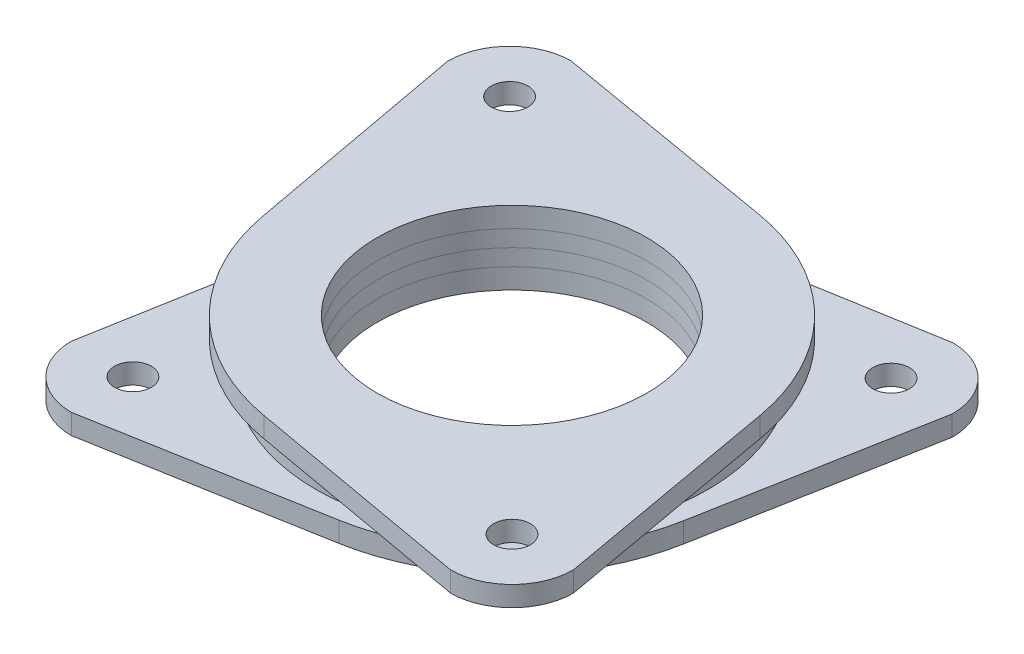
ISO-10303-21;
HEADER;
FILE_DESCRIPTION(('STEP AP214'),'2;1');
FILE_NAME('part.step','',(''),(''),'','','');
FILE_SCHEMA(('AUTOMOTIVE_DESIGN { 1 0 10303 214 1 1 1 1 }'));
ENDSEC;
DATA;
#1=APPLICATION_CONTEXT('core data for automotive mechanical design processes');
#2=APPLICATION_PROTOCOL_DEFINITION('international standard','automotive_design',2000,#1);
#3=PRODUCT_CONTEXT('',#1,'mechanical');
#4=PRODUCT('Part','Part','',(#3));
#5=PRODUCT_RELATED_PRODUCT_CATEGORY('part','',(#4));
#6=PRODUCT_DEFINITION_FORMATION('','',#4);
#7=PRODUCT_DEFINITION_CONTEXT('part definition',#1,'design');
#8=PRODUCT_DEFINITION('design','',#6,#7);
#9=PRODUCT_DEFINITION_SHAPE('','',#8);
#10=(LENGTH_UNIT() NAMED_UNIT(*) SI_UNIT(.MILLI.,.METRE.));
#11=(NAMED_UNIT(*) PLANE_ANGLE_UNIT() SI_UNIT($,.RADIAN.));
#12=(NAMED_UNIT(*) SI_UNIT($,.STERADIAN.) SOLID_ANGLE_UNIT());
#13=UNCERTAINTY_MEASURE_WITH_UNIT(LENGTH_MEASURE(1.E-05),#10,'distance_accuracy_value','');
#14=(GEOMETRIC_REPRESENTATION_CONTEXT(3) GLOBAL_UNCERTAINTY_ASSIGNED_CONTEXT((#13)) GLOBAL_UNIT_ASSIGNED_CONTEXT((#10,
#11,#12)) REPRESENTATION_CONTEXT('',''));
#15=CARTESIAN_POINT('',(0.,0.,0.));
#16=DIRECTION('',(0.,0.,1.));
#17=DIRECTION('',(1.,0.,0.));
#18=AXIS2_PLACEMENT_3D('',#15,#16,#17);
#19=CARTESIAN_POINT('',(9130.97484811199,21445.9893933236,33823.751186384));
#20=DIRECTION('',(0.,1.,0.));
#21=DIRECTION('',(0.,0.,1.));
#22=AXIS2_PLACEMENT_3D('',#19,#20,#21);
#23=PLANE('',#22);
#24=CARTESIAN_POINT('',(9130.97484811199,21445.9893933236,33823.751186384));
#25=DIRECTION('',(0.,1.,0.));
#26=DIRECTION('',(0.,0.,1.));
#27=AXIS2_PLACEMENT_3D('',#24,#25,#26);
#28=CIRCLE('',#27,16.);
#29=CARTESIAN_POINT('',(9130.97484811199,21445.9893933236,33839.751186384));
#30=VERTEX_POINT('',#29);
#31=EDGE_CURVE('P0_E12',#30,#30,#28,.T.);
#32=ORIENTED_EDGE('',*,*,#31,.T.);
#33=EDGE_LOOP('',(#32));
#34=FACE_BOUND('',#33,.T.);
#35=CARTESIAN_POINT('',(9130.97484811199,21445.9893933236,33823.751186384));
#36=DIRECTION('',(0.,1.,0.));
#37=DIRECTION('',(0.,0.,1.));
#38=AXIS2_PLACEMENT_3D('',#35,#36,#37);
#39=CIRCLE('',#38,11.025);
#40=CARTESIAN_POINT('',(9130.97484811199,21445.9893933236,33834.776186384));
#41=VERTEX_POINT('',#40);
#42=EDGE_CURVE('P0_E33',#41,#41,#39,.T.);
#43=ORIENTED_EDGE('',*,*,#42,.F.);
#44=EDGE_LOOP('',(#43));
#45=FACE_BOUND('',#44,.T.);
#46=ADVANCED_FACE('P0_F22',(#34,#45),#23,.T.);
#47=CARTESIAN_POINT('',(9130.97484811199,21444.6393933236,33823.751186384));
#48=DIRECTION('',(0.,1.,0.));
#49=DIRECTION('',(0.,0.,1.));
#50=AXIS2_PLACEMENT_3D('',#47,#48,#49);
#51=PLANE('',#50);
#52=CARTESIAN_POINT('',(9130.97484811199,21444.6393933236,33823.751186384));
#53=DIRECTION('',(0.,1.,0.));
#54=DIRECTION('',(0.,0.,1.));
#55=AXIS2_PLACEMENT_3D('',#52,#53,#54);
#56=CIRCLE('',#55,16.);
#57=CARTESIAN_POINT('',(9130.97484811199,21444.6393933236,33839.751186384));
#58=VERTEX_POINT('',#57);
#59=EDGE_CURVE('P0_E26',#58,#58,#56,.T.);
#60=ORIENTED_EDGE('',*,*,#59,.F.);
#61=EDGE_LOOP('',(#60));
#62=FACE_BOUND('',#61,.T.);
#63=CARTESIAN_POINT('',(9130.97484811199,21444.6393933236,33823.751186384));
#64=DIRECTION('',(0.,1.,0.));
#65=DIRECTION('',(0.,0.,1.));
#66=AXIS2_PLACEMENT_3D('',#63,#64,#65);
#67=CIRCLE('',#66,11.025);
#68=CARTESIAN_POINT('',(9130.97484811199,21444.6393933236,33834.776186384));
#69=VERTEX_POINT('',#68);
#70=EDGE_CURVE('P0_E35',#69,#69,#67,.T.);
#71=ORIENTED_EDGE('',*,*,#70,.T.);
#72=EDGE_LOOP('',(#71));
#73=FACE_BOUND('',#72,.T.);
#74=ADVANCED_FACE('P0_F45',(#62,#73),#51,.F.);
#75=CARTESIAN_POINT('',(9130.97484811199,21445.9893933236,33823.751186384));
#76=DIRECTION('',(0.,-1.,0.));
#77=DIRECTION('',(0.,0.,-1.));
#78=AXIS2_PLACEMENT_3D('',#75,#76,#77);
#79=CYLINDRICAL_SURFACE('',#78,16.);
#80=ORIENTED_EDGE('',*,*,#31,.F.);
#81=EDGE_LOOP('',(#80));
#82=FACE_BOUND('',#81,.T.);
#83=ORIENTED_EDGE('',*,*,#59,.T.);
#84=EDGE_LOOP('',(#83));
#85=FACE_BOUND('',#84,.T.);
#86=ADVANCED_FACE('P0_F24',(#82,#85),#79,.T.);
#87=CARTESIAN_POINT('',(9130.97484811199,21445.9893933236,33823.751186384));
#88=DIRECTION('',(0.,-1.,0.));
#89=DIRECTION('',(0.,0.,-1.));
#90=AXIS2_PLACEMENT_3D('',#87,#88,#89);
#91=CYLINDRICAL_SURFACE('',#90,11.025);
#92=ORIENTED_EDGE('',*,*,#42,.T.);
#93=EDGE_LOOP('',(#92));
#94=FACE_BOUND('',#93,.T.);
#95=ORIENTED_EDGE('',*,*,#70,.F.);
#96=EDGE_LOOP('',(#95));
#97=FACE_BOUND('',#96,.T.);
#98=ADVANCED_FACE('P0_F41',(#94,#97),#91,.F.);
#99=CLOSED_SHELL('',(#46,#74,#86,#98));
#100=MANIFOLD_SOLID_BREP('P0_B1',#99);
#101=CARTESIAN_POINT('',(9146.57249053942,21444.6393933236,33808.3494478229));
#102=DIRECTION('',(0.,-1.,0.));
#103=DIRECTION('',(0.,0.,-1.));
#104=AXIS2_PLACEMENT_3D('',#101,#102,#103);
#105=CYLINDRICAL_SURFACE('',#104,5.03499820531251);
#106=CARTESIAN_POINT('',(9146.57249053942,21442.9893933236,33808.3494478229));
#107=DIRECTION('',(0.,1.,0.));
#108=DIRECTION('',(0.,0.,1.));
#109=AXIS2_PLACEMENT_3D('',#106,#107,#108);
#110=CIRCLE('',#109,5.03499820531251);
#111=CARTESIAN_POINT('',(9146.60430910764,21442.9893933236,33803.3145501569));
#112=VERTEX_POINT('',#111);
#113=CARTESIAN_POINT('',(9151.60738820533,21442.9893933236,33808.3812663911));
#114=VERTEX_POINT('',#113);
#115=EDGE_CURVE('P1_E139',#112,#114,#110,.F.);
#116=ORIENTED_EDGE('',*,*,#115,.F.);
#117=DIRECTION('',(0.,-1.,0.));
#118=VECTOR('',#117,1.);
#119=CARTESIAN_POINT('',(9146.60430910764,21444.6393933236,33803.3145501569));
#120=LINE('',#119,#118);
#121=CARTESIAN_POINT('',(9146.60430910764,21444.6393933236,33803.3145501569));
#122=VERTEX_POINT('',#121);
#123=EDGE_CURVE('P1_E13',#122,#112,#120,.T.);
#124=ORIENTED_EDGE('',*,*,#123,.F.);
#125=CARTESIAN_POINT('',(9146.57249053942,21444.6393933236,33808.3494478229));
#126=DIRECTION('',(0.,1.,0.));
#127=DIRECTION('',(0.,0.,1.));
#128=AXIS2_PLACEMENT_3D('',#125,#126,#127);
#129=CIRCLE('',#128,5.03499820531251);
#130=CARTESIAN_POINT('',(9151.60738820533,21444.6393933236,33808.3812663911));
#131=VERTEX_POINT('',#130);
#132=EDGE_CURVE('P1_E220',#122,#131,#129,.F.);
#133=ORIENTED_EDGE('',*,*,#132,.T.);
#134=DIRECTION('',(0.,-1.,0.));
#135=VECTOR('',#134,1.);
#136=CARTESIAN_POINT('',(9151.60738820533,21444.6393933236,33808.3812663911));
#137=LINE('',#136,#135);
#138=EDGE_CURVE('P1_E41',#131,#114,#137,.T.);
#139=ORIENTED_EDGE('',*,*,#138,.T.);
#140=EDGE_LOOP('',(#116,#124,#133,#139));
#141=FACE_BOUND('',#140,.T.);
#142=ADVANCED_FACE('P1_F24',(#141),#105,.T.);
#143=CARTESIAN_POINT('',(9128.01616117805,21444.6393933236,33806.5031090524));
#144=DIRECTION('',(0.169067824794288,0.,0.985604418932528));
#145=DIRECTION('',(0.985604418932528,0.,-0.169067824794288));
#146=AXIS2_PLACEMENT_3D('',#143,#144,#145);
#147=PLANE('',#146);
#148=DIRECTION('',(-0.985604418932528,0.,0.169067824794288));
#149=VECTOR('',#148,1.);
#150=CARTESIAN_POINT('',(9128.01616117805,21442.9893933236,33806.5031090524));
#151=LINE('',#150,#149);
#152=CARTESIAN_POINT('',(9128.01616117805,21442.9893933236,33806.5031090524));
#153=VERTEX_POINT('',#152);
#154=EDGE_CURVE('P1_E136',#112,#153,#151,.T.);
#155=ORIENTED_EDGE('',*,*,#154,.T.);
#156=DIRECTION('',(0.,-1.,0.));
#157=VECTOR('',#156,1.);
#158=CARTESIAN_POINT('',(9128.01616117805,21444.6393933236,33806.5031090524));
#159=LINE('',#158,#157);
#160=CARTESIAN_POINT('',(9128.01616117805,21444.6393933236,33806.5031090524));
#161=VERTEX_POINT('',#160);
#162=EDGE_CURVE('P1_E33',#161,#153,#159,.T.);
#163=ORIENTED_EDGE('',*,*,#162,.F.);
#164=DIRECTION('',(-0.985604418932528,0.,0.169067824794288));
#165=VECTOR('',#164,1.);
#166=CARTESIAN_POINT('',(9128.01616117805,21444.6393933236,33806.5031090524));
#167=LINE('',#166,#165);
#168=EDGE_CURVE('P1_E222',#122,#161,#167,.T.);
#169=ORIENTED_EDGE('',*,*,#168,.F.);
#170=ORIENTED_EDGE('',*,*,#123,.T.);
#171=EDGE_LOOP('',(#155,#163,#169,#170));
#172=FACE_BOUND('',#171,.T.);
#173=ADVANCED_FACE('P1_F137',(#172),#147,.F.);
#174=CARTESIAN_POINT('',(9130.97484811199,21444.6393933236,33823.751186384));
#175=DIRECTION('',(0.,-1.,0.));
#176=DIRECTION('',(0.,0.,-1.));
#177=AXIS2_PLACEMENT_3D('',#174,#175,#176);
#178=CYLINDRICAL_SURFACE('',#177,17.5000000002764);
#179=CARTESIAN_POINT('',(9130.97484811199,21442.9893933236,33823.751186384));
#180=DIRECTION('',(0.,1.,0.));
#181=DIRECTION('',(0.,0.,1.));
#182=AXIS2_PLACEMENT_3D('',#179,#180,#181);
#183=CIRCLE('',#182,17.5000000002764);
#184=CARTESIAN_POINT('',(9113.74581255351,21442.9893933236,33820.6835596574));
#185=VERTEX_POINT('',#184);
#186=EDGE_CURVE('P1_E130',#153,#185,#183,.T.);
#187=ORIENTED_EDGE('',*,*,#186,.T.);
#188=DIRECTION('',(0.,-1.,0.));
#189=VECTOR('',#188,1.);
#190=CARTESIAN_POINT('',(9113.74581255351,21444.6393933236,33820.6835596574));
#191=LINE('',#190,#189);
#192=CARTESIAN_POINT('',(9113.74581255351,21444.6393933236,33820.6835596574));
#193=VERTEX_POINT('',#192);
#194=EDGE_CURVE('P1_E122',#193,#185,#191,.T.);
#195=ORIENTED_EDGE('',*,*,#194,.F.);
#196=CARTESIAN_POINT('',(9130.97484811199,21444.6393933236,33823.751186384));
#197=DIRECTION('',(0.,1.,0.));
#198=DIRECTION('',(0.,0.,1.));
#199=AXIS2_PLACEMENT_3D('',#196,#197,#198);
#200=CIRCLE('',#199,17.5000000002764);
#201=EDGE_CURVE('P1_E132',#161,#193,#200,.T.);
#202=ORIENTED_EDGE('',*,*,#201,.F.);
#203=ORIENTED_EDGE('',*,*,#162,.T.);
#204=EDGE_LOOP('',(#187,#195,#202,#203));
#205=FACE_BOUND('',#204,.T.);
#206=ADVANCED_FACE('P1_F128',(#205),#178,.T.);
#207=CARTESIAN_POINT('',(9113.74581255351,21444.6393933236,33820.6835596574));
#208=DIRECTION('',(-0.984516317612263,0.,-0.175292955805959));
#209=DIRECTION('',(-0.175292955805959,0.,0.984516317612263));
#210=AXIS2_PLACEMENT_3D('',#207,#208,#209);
#211=PLANE('',#210);
#212=DIRECTION('',(0.175292955805959,0.,-0.984516317612263));
#213=VECTOR('',#212,1.);
#214=CARTESIAN_POINT('',(9113.74581255351,21442.9893933236,33820.6835596574));
#215=LINE('',#214,#213);
#216=CARTESIAN_POINT('',(9110.43984990668,21442.9893933236,33839.251186384));
#217=VERTEX_POINT('',#216);
#218=EDGE_CURVE('P1_E141',#217,#185,#215,.T.);
#219=ORIENTED_EDGE('',*,*,#218,.F.);
#220=DIRECTION('',(0.,-1.,0.));
#221=VECTOR('',#220,1.);
#222=CARTESIAN_POINT('',(9110.43984990668,21444.6393933236,33839.251186384));
#223=LINE('',#222,#221);
#224=CARTESIAN_POINT('',(9110.43984990668,21444.6393933236,33839.251186384));
#225=VERTEX_POINT('',#224);
#226=EDGE_CURVE('P1_E116',#225,#217,#223,.T.);
#227=ORIENTED_EDGE('',*,*,#226,.F.);
#228=DIRECTION('',(0.175292955805959,0.,-0.984516317612263));
#229=VECTOR('',#228,1.);
#230=CARTESIAN_POINT('',(9113.74581255351,21444.6393933236,33820.6835596574));
#231=LINE('',#230,#229);
#232=EDGE_CURVE('P1_E229',#225,#193,#231,.T.);
#233=ORIENTED_EDGE('',*,*,#232,.T.);
#234=ORIENTED_EDGE('',*,*,#194,.T.);
#235=EDGE_LOOP('',(#219,#227,#233,#234));
#236=FACE_BOUND('',#235,.T.);
#237=ADVANCED_FACE('P1_F191',(#236),#211,.T.);
#238=CARTESIAN_POINT('',(9115.47484811198,21444.6393933236,33839.251186384));
#239=DIRECTION('',(0.,-1.,0.));
#240=DIRECTION('',(0.,0.,-1.));
#241=AXIS2_PLACEMENT_3D('',#238,#239,#240);
#242=CYLINDRICAL_SURFACE('',#241,5.03499820531251);
#243=CARTESIAN_POINT('',(9115.47484811198,21442.9893933236,33839.251186384));
#244=DIRECTION('',(0.,1.,0.));
#245=DIRECTION('',(0.,0.,1.));
#246=AXIS2_PLACEMENT_3D('',#243,#244,#245);
#247=CIRCLE('',#246,5.03499820531251);
#248=CARTESIAN_POINT('',(9115.47484811199,21442.9893933236,33844.2861845893));
#249=VERTEX_POINT('',#248);
#250=EDGE_CURVE('P1_E148',#217,#249,#247,.T.);
#251=ORIENTED_EDGE('',*,*,#250,.T.);
#252=DIRECTION('',(0.,-1.,0.));
#253=VECTOR('',#252,1.);
#254=CARTESIAN_POINT('',(9115.47484811199,21444.6393933236,33844.2861845893));
#255=LINE('',#254,#253);
#256=CARTESIAN_POINT('',(9115.47484811199,21444.6393933236,33844.2861845893));
#257=VERTEX_POINT('',#256);
#258=EDGE_CURVE('P1_E114',#257,#249,#255,.T.);
#259=ORIENTED_EDGE('',*,*,#258,.F.);
#260=CARTESIAN_POINT('',(9115.47484811198,21444.6393933236,33839.251186384));
#261=DIRECTION('',(0.,1.,0.));
#262=DIRECTION('',(0.,0.,1.));
#263=AXIS2_PLACEMENT_3D('',#260,#261,#262);
#264=CIRCLE('',#263,5.03499820531251);
#265=EDGE_CURVE('P1_E107',#225,#257,#264,.T.);
#266=ORIENTED_EDGE('',*,*,#265,.F.);
#267=ORIENTED_EDGE('',*,*,#226,.T.);
#268=EDGE_LOOP('',(#251,#259,#266,#267));
#269=FACE_BOUND('',#268,.T.);
#270=ADVANCED_FACE('P1_F194',(#269),#242,.T.);
#271=CARTESIAN_POINT('',(9134.04247483864,21444.6393933236,33840.9802219425));
#272=DIRECTION('',(-0.175292955805959,0.,-0.984516317612263));
#273=DIRECTION('',(-0.984516317612263,0.,0.175292955805959));
#274=AXIS2_PLACEMENT_3D('',#271,#272,#273);
#275=PLANE('',#274);
#276=DIRECTION('',(0.984516317612263,0.,-0.175292955805959));
#277=VECTOR('',#276,1.);
#278=CARTESIAN_POINT('',(9134.04247483864,21442.9893933236,33840.9802219425));
#279=LINE('',#278,#277);
#280=CARTESIAN_POINT('',(9134.04247483864,21442.9893933236,33840.9802219425));
#281=VERTEX_POINT('',#280);
#282=EDGE_CURVE('P1_E113',#249,#281,#279,.T.);
#283=ORIENTED_EDGE('',*,*,#282,.T.);
#284=DIRECTION('',(0.,-1.,0.));
#285=VECTOR('',#284,1.);
#286=CARTESIAN_POINT('',(9134.04247483864,21444.6393933236,33840.9802219425));
#287=LINE('',#286,#285);
#288=CARTESIAN_POINT('',(9134.04247483864,21444.6393933236,33840.9802219425));
#289=VERTEX_POINT('',#288);
#290=EDGE_CURVE('P1_E95',#289,#281,#287,.T.);
#291=ORIENTED_EDGE('',*,*,#290,.F.);
#292=DIRECTION('',(0.984516317612263,0.,-0.175292955805959));
#293=VECTOR('',#292,1.);
#294=CARTESIAN_POINT('',(9134.04247483864,21444.6393933236,33840.9802219425));
#295=LINE('',#294,#293);
#296=EDGE_CURVE('P1_E100',#257,#289,#295,.T.);
#297=ORIENTED_EDGE('',*,*,#296,.F.);
#298=ORIENTED_EDGE('',*,*,#258,.T.);
#299=EDGE_LOOP('',(#283,#291,#297,#298));
#300=FACE_BOUND('',#299,.T.);
#301=ADVANCED_FACE('P1_F112',(#300),#275,.F.);
#302=CARTESIAN_POINT('',(9130.97484811199,21444.6393933236,33823.751186384));
#303=DIRECTION('',(0.,-1.,0.));
#304=DIRECTION('',(0.,0.,-1.));
#305=AXIS2_PLACEMENT_3D('',#302,#303,#304);
#306=CYLINDRICAL_SURFACE('',#305,17.5000000002763);
#307=CARTESIAN_POINT('',(9130.97484811199,21442.9893933236,33823.751186384));
#308=DIRECTION('',(0.,1.,0.));
#309=DIRECTION('',(0.,0.,1.));
#310=AXIS2_PLACEMENT_3D('',#307,#308,#309);
#311=CIRCLE('',#310,17.5000000002763);
#312=CARTESIAN_POINT('',(9148.18415383481,21442.9893933236,33826.927630394));
#313=VERTEX_POINT('',#312);
#314=EDGE_CURVE('P1_E152',#281,#313,#311,.T.);
#315=ORIENTED_EDGE('',*,*,#314,.T.);
#316=DIRECTION('',(0.,-1.,0.));
#317=VECTOR('',#316,1.);
#318=CARTESIAN_POINT('',(9148.18415383481,21444.6393933236,33826.927630394));
#319=LINE('',#318,#317);
#320=CARTESIAN_POINT('',(9148.18415383481,21444.6393933236,33826.927630394));
#321=VERTEX_POINT('',#320);
#322=EDGE_CURVE('P1_E67',#321,#313,#319,.T.);
#323=ORIENTED_EDGE('',*,*,#322,.F.);
#324=CARTESIAN_POINT('',(9130.97484811199,21444.6393933236,33823.751186384));
#325=DIRECTION('',(0.,1.,0.));
#326=DIRECTION('',(0.,0.,1.));
#327=AXIS2_PLACEMENT_3D('',#324,#325,#326);
#328=CIRCLE('',#327,17.5000000002763);
#329=EDGE_CURVE('P1_E91',#289,#321,#328,.T.);
#330=ORIENTED_EDGE('',*,*,#329,.F.);
#331=ORIENTED_EDGE('',*,*,#290,.T.);
#332=EDGE_LOOP('',(#315,#323,#330,#331));
#333=FACE_BOUND('',#332,.T.);
#334=ADVANCED_FACE('P1_F93',(#333),#306,.T.);
#335=CARTESIAN_POINT('',(9115.47484811198,21444.6393933236,33839.251186384));
#336=DIRECTION('',(0.,-1.,0.));
#337=DIRECTION('',(0.,0.,-1.));
#338=AXIS2_PLACEMENT_3D('',#335,#336,#337);
#339=CYLINDRICAL_SURFACE('',#338,1.5);
#340=CARTESIAN_POINT('',(9115.47484811198,21444.6393933236,33839.251186384));
#341=DIRECTION('',(0.,1.,0.));
#342=DIRECTION('',(0.,0.,1.));
#343=AXIS2_PLACEMENT_3D('',#340,#341,#342);
#344=CIRCLE('',#343,1.5);
#345=CARTESIAN_POINT('',(9115.47484811198,21444.6393933236,33840.751186384));
#346=VERTEX_POINT('',#345);
#347=EDGE_CURVE('P1_E219',#346,#346,#344,.T.);
#348=ORIENTED_EDGE('',*,*,#347,.T.);
#349=EDGE_LOOP('',(#348));
#350=FACE_BOUND('',#349,.T.);
#351=CARTESIAN_POINT('',(9115.47484811198,21442.9893933236,33839.251186384));
#352=DIRECTION('',(0.,1.,0.));
#353=DIRECTION('',(0.,0.,1.));
#354=AXIS2_PLACEMENT_3D('',#351,#352,#353);
#355=CIRCLE('',#354,1.5);
#356=CARTESIAN_POINT('',(9115.47484811198,21442.9893933236,33840.751186384));
#357=VERTEX_POINT('',#356);
#358=EDGE_CURVE('P1_E143',#357,#357,#355,.T.);
#359=ORIENTED_EDGE('',*,*,#358,.F.);
#360=EDGE_LOOP('',(#359));
#361=FACE_BOUND('',#360,.T.);
#362=ADVANCED_FACE('P1_F169',(#350,#361),#339,.F.);
#363=CARTESIAN_POINT('',(9146.57249053942,21444.6393933236,33808.3494478229));
#364=DIRECTION('',(0.,-1.,0.));
#365=DIRECTION('',(0.,0.,-1.));
#366=AXIS2_PLACEMENT_3D('',#363,#364,#365);
#367=CYLINDRICAL_SURFACE('',#366,1.49999999999998);
#368=CARTESIAN_POINT('',(9146.57249053942,21444.6393933236,33808.3494478229));
#369=DIRECTION('',(0.,1.,0.));
#370=DIRECTION('',(0.,0.,1.));
#371=AXIS2_PLACEMENT_3D('',#368,#369,#370);
#372=CIRCLE('',#371,1.49999999999998);
#373=CARTESIAN_POINT('',(9146.57249053942,21444.6393933236,33809.8494478229));
#374=VERTEX_POINT('',#373);
#375=EDGE_CURVE('P1_E217',#374,#374,#372,.T.);
#376=ORIENTED_EDGE('',*,*,#375,.T.);
#377=EDGE_LOOP('',(#376));
#378=FACE_BOUND('',#377,.T.);
#379=CARTESIAN_POINT('',(9146.57249053942,21442.9893933236,33808.3494478229));
#380=DIRECTION('',(0.,1.,0.));
#381=DIRECTION('',(0.,0.,1.));
#382=AXIS2_PLACEMENT_3D('',#379,#380,#381);
#383=CIRCLE('',#382,1.49999999999998);
#384=CARTESIAN_POINT('',(9146.57249053942,21442.9893933236,33809.8494478229));
#385=VERTEX_POINT('',#384);
#386=EDGE_CURVE('P1_E162',#385,#385,#383,.T.);
#387=ORIENTED_EDGE('',*,*,#386,.F.);
#388=EDGE_LOOP('',(#387));
#389=FACE_BOUND('',#388,.T.);
#390=ADVANCED_FACE('P1_F171',(#378,#389),#367,.F.);
#391=CARTESIAN_POINT('',(9130.97484811199,21444.6393933236,33823.751186384));
#392=DIRECTION('',(0.,-1.,0.));
#393=DIRECTION('',(0.,0.,-1.));
#394=AXIS2_PLACEMENT_3D('',#391,#392,#393);
#395=CYLINDRICAL_SURFACE('',#394,11.025);
#396=CARTESIAN_POINT('',(9130.97484811199,21444.6393933236,33823.751186384));
#397=DIRECTION('',(0.,1.,0.));
#398=DIRECTION('',(0.,0.,1.));
#399=AXIS2_PLACEMENT_3D('',#396,#397,#398);
#400=CIRCLE('',#399,11.025);
#401=CARTESIAN_POINT('',(9130.97484811199,21444.6393933236,33834.776186384));
#402=VERTEX_POINT('',#401);
#403=EDGE_CURVE('P1_E156',#402,#402,#400,.T.);
#404=ORIENTED_EDGE('',*,*,#403,.T.);
#405=EDGE_LOOP('',(#404));
#406=FACE_BOUND('',#405,.T.);
#407=CARTESIAN_POINT('',(9130.97484811199,21442.9893933236,33823.751186384));
#408=DIRECTION('',(0.,1.,0.));
#409=DIRECTION('',(0.,0.,1.));
#410=AXIS2_PLACEMENT_3D('',#407,#408,#409);
#411=CIRCLE('',#410,11.025);
#412=CARTESIAN_POINT('',(9130.97484811199,21442.9893933236,33834.776186384));
#413=VERTEX_POINT('',#412);
#414=EDGE_CURVE('P1_E159',#413,#413,#411,.T.);
#415=ORIENTED_EDGE('',*,*,#414,.F.);
#416=EDGE_LOOP('',(#415));
#417=FACE_BOUND('',#416,.T.);
#418=ADVANCED_FACE('P1_F26',(#406,#417),#395,.F.);
#419=CARTESIAN_POINT('',(9148.18415383481,21444.6393933236,33826.927630394));
#420=DIRECTION('',(0.983388898431157,0.,0.181511086279478));
#421=DIRECTION('',(0.181511086279478,0.,-0.983388898431157));
#422=AXIS2_PLACEMENT_3D('',#419,#420,#421);
#423=PLANE('',#422);
#424=DIRECTION('',(-0.181511086279478,0.,0.983388898431157));
#425=VECTOR('',#424,1.);
#426=CARTESIAN_POINT('',(9148.18415383481,21442.9893933236,33826.927630394));
#427=LINE('',#426,#425);
#428=EDGE_CURVE('P1_E154',#114,#313,#427,.T.);
#429=ORIENTED_EDGE('',*,*,#428,.F.);
#430=ORIENTED_EDGE('',*,*,#138,.F.);
#431=DIRECTION('',(-0.181511086279478,0.,0.983388898431157));
#432=VECTOR('',#431,1.);
#433=CARTESIAN_POINT('',(9148.18415383481,21444.6393933236,33826.927630394));
#434=LINE('',#433,#432);
#435=EDGE_CURVE('P1_E99',#131,#321,#434,.T.);
#436=ORIENTED_EDGE('',*,*,#435,.T.);
#437=ORIENTED_EDGE('',*,*,#322,.T.);
#438=EDGE_LOOP('',(#429,#430,#436,#437));
#439=FACE_BOUND('',#438,.T.);
#440=ADVANCED_FACE('P1_F201',(#439),#423,.T.);
#441=CARTESIAN_POINT('',(9130.97484811199,21444.6393933236,33823.751186384));
#442=DIRECTION('',(0.,1.,0.));
#443=DIRECTION('',(0.,0.,1.));
#444=AXIS2_PLACEMENT_3D('',#441,#442,#443);
#445=PLANE('',#444);
#446=ORIENTED_EDGE('',*,*,#403,.F.);
#447=EDGE_LOOP('',(#446));
#448=FACE_BOUND('',#447,.T.);
#449=ORIENTED_EDGE('',*,*,#375,.F.);
#450=EDGE_LOOP('',(#449));
#451=FACE_BOUND('',#450,.T.);
#452=ORIENTED_EDGE('',*,*,#347,.F.);
#453=EDGE_LOOP('',(#452));
#454=FACE_BOUND('',#453,.T.);
#455=ORIENTED_EDGE('',*,*,#132,.F.);
#456=ORIENTED_EDGE('',*,*,#168,.T.);
#457=ORIENTED_EDGE('',*,*,#201,.T.);
#458=ORIENTED_EDGE('',*,*,#232,.F.);
#459=ORIENTED_EDGE('',*,*,#265,.T.);
#460=ORIENTED_EDGE('',*,*,#296,.T.);
#461=ORIENTED_EDGE('',*,*,#329,.T.);
#462=ORIENTED_EDGE('',*,*,#435,.F.);
#463=EDGE_LOOP('',(#455,#456,#457,#458,#459,#460,#461,#462));
#464=FACE_BOUND('',#463,.T.);
#465=ADVANCED_FACE('P1_F104',(#448,#451,#454,#464),#445,.T.);
#466=CARTESIAN_POINT('',(9130.97484811199,21442.9893933236,33823.751186384));
#467=DIRECTION('',(0.,1.,0.));
#468=DIRECTION('',(0.,0.,1.));
#469=AXIS2_PLACEMENT_3D('',#466,#467,#468);
#470=PLANE('',#469);
#471=ORIENTED_EDGE('',*,*,#414,.T.);
#472=EDGE_LOOP('',(#471));
#473=FACE_BOUND('',#472,.T.);
#474=ORIENTED_EDGE('',*,*,#386,.T.);
#475=EDGE_LOOP('',(#474));
#476=FACE_BOUND('',#475,.T.);
#477=ORIENTED_EDGE('',*,*,#358,.T.);
#478=EDGE_LOOP('',(#477));
#479=FACE_BOUND('',#478,.T.);
#480=ORIENTED_EDGE('',*,*,#115,.T.);
#481=ORIENTED_EDGE('',*,*,#428,.T.);
#482=ORIENTED_EDGE('',*,*,#314,.F.);
#483=ORIENTED_EDGE('',*,*,#282,.F.);
#484=ORIENTED_EDGE('',*,*,#250,.F.);
#485=ORIENTED_EDGE('',*,*,#218,.T.);
#486=ORIENTED_EDGE('',*,*,#186,.F.);
#487=ORIENTED_EDGE('',*,*,#154,.F.);
#488=EDGE_LOOP('',(#480,#481,#482,#483,#484,#485,#486,#487));
#489=FACE_BOUND('',#488,.T.);
#490=ADVANCED_FACE('P1_F167',(#473,#476,#479,#489),#470,.F.);
#491=CLOSED_SHELL('',(#142,#173,#206,#237,#270,#301,#334,#362,#390,#418,#440,#465,#490));
#492=MANIFOLD_SOLID_BREP('P1_B1',#491);
#493=CARTESIAN_POINT('',(9130.97484811199,21445.9893933236,33823.751186384));
#494=DIRECTION('',(0.,-1.,0.));
#495=DIRECTION('',(0.,0.,1.));
#496=AXIS2_PLACEMENT_3D('',#493,#494,#495);
#497=PLANE('',#496);
#498=CARTESIAN_POINT('',(9130.97484811199,21445.9893933236,33823.751186384));
#499=DIRECTION('',(0.,-1.,0.));
#500=DIRECTION('',(0.,0.,1.));
#501=AXIS2_PLACEMENT_3D('',#498,#499,#500);
#502=CIRCLE('',#501,16.);
#503=CARTESIAN_POINT('',(9130.97484811199,21445.9893933236,33839.751186384));
#504=VERTEX_POINT('',#503);
#505=EDGE_CURVE('P2_E12',#504,#504,#502,.T.);
#506=ORIENTED_EDGE('',*,*,#505,.T.);
#507=EDGE_LOOP('',(#506));
#508=FACE_BOUND('',#507,.T.);
#509=CARTESIAN_POINT('',(9130.97484811199,21445.9893933236,33823.751186384));
#510=DIRECTION('',(0.,-1.,0.));
#511=DIRECTION('',(0.,0.,1.));
#512=AXIS2_PLACEMENT_3D('',#509,#510,#511);
#513=CIRCLE('',#512,11.025);
#514=CARTESIAN_POINT('',(9130.97484811199,21445.9893933236,33834.776186384));
#515=VERTEX_POINT('',#514);
#516=EDGE_CURVE('P2_E33',#515,#515,#513,.T.);
#517=ORIENTED_EDGE('',*,*,#516,.F.);
#518=EDGE_LOOP('',(#517));
#519=FACE_BOUND('',#518,.T.);
#520=ADVANCED_FACE('P2_F22',(#508,#519),#497,.T.);
#521=CARTESIAN_POINT('',(9130.97484811199,21447.3393933236,33823.751186384));
#522=DIRECTION('',(0.,-1.,0.));
#523=DIRECTION('',(0.,0.,1.));
#524=AXIS2_PLACEMENT_3D('',#521,#522,#523);
#525=PLANE('',#524);
#526=CARTESIAN_POINT('',(9130.97484811199,21447.3393933236,33823.751186384));
#527=DIRECTION('',(0.,-1.,0.));
#528=DIRECTION('',(0.,0.,1.));
#529=AXIS2_PLACEMENT_3D('',#526,#527,#528);
#530=CIRCLE('',#529,16.);
#531=CARTESIAN_POINT('',(9130.97484811199,21447.3393933236,33839.751186384));
#532=VERTEX_POINT('',#531);
#533=EDGE_CURVE('P2_E26',#532,#532,#530,.T.);
#534=ORIENTED_EDGE('',*,*,#533,.F.);
#535=EDGE_LOOP('',(#534));
#536=FACE_BOUND('',#535,.T.);
#537=CARTESIAN_POINT('',(9130.97484811199,21447.3393933236,33823.751186384));
#538=DIRECTION('',(0.,-1.,0.));
#539=DIRECTION('',(0.,0.,1.));
#540=AXIS2_PLACEMENT_3D('',#537,#538,#539);
#541=CIRCLE('',#540,11.025);
#542=CARTESIAN_POINT('',(9130.97484811199,21447.3393933236,33834.776186384));
#543=VERTEX_POINT('',#542);
#544=EDGE_CURVE('P2_E35',#543,#543,#541,.T.);
#545=ORIENTED_EDGE('',*,*,#544,.T.);
#546=EDGE_LOOP('',(#545));
#547=FACE_BOUND('',#546,.T.);
#548=ADVANCED_FACE('P2_F45',(#536,#547),#525,.F.);
#549=CARTESIAN_POINT('',(9130.97484811199,21445.9893933236,33823.751186384));
#550=DIRECTION('',(0.,1.,0.));
#551=DIRECTION('',(0.,0.,-1.));
#552=AXIS2_PLACEMENT_3D('',#549,#550,#551);
#553=CYLINDRICAL_SURFACE('',#552,16.);
#554=ORIENTED_EDGE('',*,*,#505,.F.);
#555=EDGE_LOOP('',(#554));
#556=FACE_BOUND('',#555,.T.);
#557=ORIENTED_EDGE('',*,*,#533,.T.);
#558=EDGE_LOOP('',(#557));
#559=FACE_BOUND('',#558,.T.);
#560=ADVANCED_FACE('P2_F24',(#556,#559),#553,.T.);
#561=CARTESIAN_POINT('',(9130.97484811199,21445.9893933236,33823.751186384));
#562=DIRECTION('',(0.,1.,0.));
#563=DIRECTION('',(0.,0.,-1.));
#564=AXIS2_PLACEMENT_3D('',#561,#562,#563);
#565=CYLINDRICAL_SURFACE('',#564,11.025);
#566=ORIENTED_EDGE('',*,*,#516,.T.);
#567=EDGE_LOOP('',(#566));
#568=FACE_BOUND('',#567,.T.);
#569=ORIENTED_EDGE('',*,*,#544,.F.);
#570=EDGE_LOOP('',(#569));
#571=FACE_BOUND('',#570,.T.);
#572=ADVANCED_FACE('P2_F41',(#568,#571),#565,.F.);
#573=CLOSED_SHELL('',(#520,#548,#560,#572));
#574=MANIFOLD_SOLID_BREP('P2_B1',#573);
#575=CARTESIAN_POINT('',(9115.37720568457,21447.3393933236,33808.3494478229));
#576=DIRECTION('',(0.,1.,0.));
#577=DIRECTION('',(0.,0.,-1.));
#578=AXIS2_PLACEMENT_3D('',#575,#576,#577);
#579=CYLINDRICAL_SURFACE('',#578,5.03499820531251);
#580=CARTESIAN_POINT('',(9115.37720568457,21448.9893933236,33808.3494478229));
#581=DIRECTION('',(0.,-1.,0.));
#582=DIRECTION('',(0.,0.,1.));
#583=AXIS2_PLACEMENT_3D('',#580,#581,#582);
#584=CIRCLE('',#583,5.03499820531251);
#585=CARTESIAN_POINT('',(9115.34538711633,21448.9893933236,33803.314550157));
#586=VERTEX_POINT('',#585);
#587=CARTESIAN_POINT('',(9110.34230801866,21448.9893933236,33808.3812663911));
#588=VERTEX_POINT('',#587);
#589=EDGE_CURVE('P3_E139',#586,#588,#584,.F.);
#590=ORIENTED_EDGE('',*,*,#589,.F.);
#591=DIRECTION('',(0.,1.,0.));
#592=VECTOR('',#591,1.);
#593=CARTESIAN_POINT('',(9115.34538711633,21447.3393933236,33803.314550157));
#594=LINE('',#593,#592);
#595=CARTESIAN_POINT('',(9115.34538711633,21447.3393933236,33803.314550157));
#596=VERTEX_POINT('',#595);
#597=EDGE_CURVE('P3_E13',#596,#586,#594,.T.);
#598=ORIENTED_EDGE('',*,*,#597,.F.);
#599=CARTESIAN_POINT('',(9115.37720568457,21447.3393933236,33808.3494478229));
#600=DIRECTION('',(0.,-1.,0.));
#601=DIRECTION('',(0.,0.,1.));
#602=AXIS2_PLACEMENT_3D('',#599,#600,#601);
#603=CIRCLE('',#602,5.03499820531251);
#604=CARTESIAN_POINT('',(9110.34230801866,21447.3393933236,33808.3812663911));
#605=VERTEX_POINT('',#604);
#606=EDGE_CURVE('P3_E220',#596,#605,#603,.F.);
#607=ORIENTED_EDGE('',*,*,#606,.T.);
#608=DIRECTION('',(0.,1.,0.));
#609=VECTOR('',#608,1.);
#610=CARTESIAN_POINT('',(9110.34230801866,21447.3393933236,33808.3812663911));
#611=LINE('',#610,#609);
#612=EDGE_CURVE('P3_E41',#605,#588,#611,.T.);
#613=ORIENTED_EDGE('',*,*,#612,.T.);
#614=EDGE_LOOP('',(#590,#598,#607,#613));
#615=FACE_BOUND('',#614,.T.);
#616=ADVANCED_FACE('P3_F24',(#615),#579,.T.);
#617=CARTESIAN_POINT('',(9133.93353504594,21447.3393933236,33806.5031090524));
#618=DIRECTION('',(-0.169067824794288,0.,0.985604418932528));
#619=DIRECTION('',(-0.985604418932528,0.,-0.169067824794288));
#620=AXIS2_PLACEMENT_3D('',#617,#618,#619);
#621=PLANE('',#620);
#622=DIRECTION('',(0.985604418932528,0.,0.169067824794288));
#623=VECTOR('',#622,1.);
#624=CARTESIAN_POINT('',(9133.93353504594,21448.9893933236,33806.5031090524));
#625=LINE('',#624,#623);
#626=CARTESIAN_POINT('',(9133.93353504594,21448.9893933236,33806.5031090524));
#627=VERTEX_POINT('',#626);
#628=EDGE_CURVE('P3_E136',#586,#627,#625,.T.);
#629=ORIENTED_EDGE('',*,*,#628,.T.);
#630=DIRECTION('',(0.,1.,0.));
#631=VECTOR('',#630,1.);
#632=CARTESIAN_POINT('',(9133.93353504594,21447.3393933236,33806.5031090524));
#633=LINE('',#632,#631);
#634=CARTESIAN_POINT('',(9133.93353504594,21447.3393933236,33806.5031090524));
#635=VERTEX_POINT('',#634);
#636=EDGE_CURVE('P3_E33',#635,#627,#633,.T.);
#637=ORIENTED_EDGE('',*,*,#636,.F.);
#638=DIRECTION('',(0.985604418932528,0.,0.169067824794288));
#639=VECTOR('',#638,1.);
#640=CARTESIAN_POINT('',(9133.93353504594,21447.3393933236,33806.5031090524));
#641=LINE('',#640,#639);
#642=EDGE_CURVE('P3_E222',#596,#635,#641,.T.);
#643=ORIENTED_EDGE('',*,*,#642,.F.);
#644=ORIENTED_EDGE('',*,*,#597,.T.);
#645=EDGE_LOOP('',(#629,#637,#643,#644));
#646=FACE_BOUND('',#645,.T.);
#647=ADVANCED_FACE('P3_F137',(#646),#621,.F.);
#648=CARTESIAN_POINT('',(9130.97484811199,21447.3393933236,33823.751186384));
#649=DIRECTION('',(0.,1.,0.));
#650=DIRECTION('',(0.,0.,-1.));
#651=AXIS2_PLACEMENT_3D('',#648,#649,#650);
#652=CYLINDRICAL_SURFACE('',#651,17.5000000002764);
#653=CARTESIAN_POINT('',(9130.97484811199,21448.9893933236,33823.751186384));
#654=DIRECTION('',(0.,-1.,0.));
#655=DIRECTION('',(0.,0.,1.));
#656=AXIS2_PLACEMENT_3D('',#653,#654,#655);
#657=CIRCLE('',#656,17.5000000002764);
#658=CARTESIAN_POINT('',(9148.20388367048,21448.9893933236,33820.6835596574));
#659=VERTEX_POINT('',#658);
#660=EDGE_CURVE('P3_E130',#627,#659,#657,.T.);
#661=ORIENTED_EDGE('',*,*,#660,.T.);
#662=DIRECTION('',(0.,1.,0.));
#663=VECTOR('',#662,1.);
#664=CARTESIAN_POINT('',(9148.20388367048,21447.3393933236,33820.6835596574));
#665=LINE('',#664,#663);
#666=CARTESIAN_POINT('',(9148.20388367048,21447.3393933236,33820.6835596574));
#667=VERTEX_POINT('',#666);
#668=EDGE_CURVE('P3_E122',#667,#659,#665,.T.);
#669=ORIENTED_EDGE('',*,*,#668,.F.);
#670=CARTESIAN_POINT('',(9130.97484811199,21447.3393933236,33823.751186384));
#671=DIRECTION('',(0.,-1.,0.));
#672=DIRECTION('',(0.,0.,1.));
#673=AXIS2_PLACEMENT_3D('',#670,#671,#672);
#674=CIRCLE('',#673,17.5000000002764);
#675=EDGE_CURVE('P3_E132',#635,#667,#674,.T.);
#676=ORIENTED_EDGE('',*,*,#675,.F.);
#677=ORIENTED_EDGE('',*,*,#636,.T.);
#678=EDGE_LOOP('',(#661,#669,#676,#677));
#679=FACE_BOUND('',#678,.T.);
#680=ADVANCED_FACE('P3_F128',(#679),#652,.T.);
#681=CARTESIAN_POINT('',(9148.20388367048,21447.3393933236,33820.6835596574));
#682=DIRECTION('',(0.984516317612263,0.,-0.175292955805959));
#683=DIRECTION('',(0.175292955805959,0.,0.984516317612263));
#684=AXIS2_PLACEMENT_3D('',#681,#682,#683);
#685=PLANE('',#684);
#686=DIRECTION('',(-0.175292955805959,0.,-0.984516317612263));
#687=VECTOR('',#686,1.);
#688=CARTESIAN_POINT('',(9148.20388367048,21448.9893933236,33820.6835596574));
#689=LINE('',#688,#687);
#690=CARTESIAN_POINT('',(9151.50984631731,21448.9893933236,33839.2511863841));
#691=VERTEX_POINT('',#690);
#692=EDGE_CURVE('P3_E141',#691,#659,#689,.T.);
#693=ORIENTED_EDGE('',*,*,#692,.F.);
#694=DIRECTION('',(0.,1.,0.));
#695=VECTOR('',#694,1.);
#696=CARTESIAN_POINT('',(9151.50984631731,21447.3393933236,33839.2511863841));
#697=LINE('',#696,#695);
#698=CARTESIAN_POINT('',(9151.50984631731,21447.3393933236,33839.2511863841));
#699=VERTEX_POINT('',#698);
#700=EDGE_CURVE('P3_E116',#699,#691,#697,.T.);
#701=ORIENTED_EDGE('',*,*,#700,.F.);
#702=DIRECTION('',(-0.175292955805959,0.,-0.984516317612263));
#703=VECTOR('',#702,1.);
#704=CARTESIAN_POINT('',(9148.20388367048,21447.3393933236,33820.6835596574));
#705=LINE('',#704,#703);
#706=EDGE_CURVE('P3_E229',#699,#667,#705,.T.);
#707=ORIENTED_EDGE('',*,*,#706,.T.);
#708=ORIENTED_EDGE('',*,*,#668,.T.);
#709=EDGE_LOOP('',(#693,#701,#707,#708));
#710=FACE_BOUND('',#709,.T.);
#711=ADVANCED_FACE('P3_F191',(#710),#685,.T.);
#712=CARTESIAN_POINT('',(9146.47484811198,21447.3393933236,33839.2511863841));
#713=DIRECTION('',(0.,1.,0.));
#714=DIRECTION('',(0.,0.,-1.));
#715=AXIS2_PLACEMENT_3D('',#712,#713,#714);
#716=CYLINDRICAL_SURFACE('',#715,5.03499820531251);
#717=CARTESIAN_POINT('',(9146.47484811198,21448.9893933236,33839.2511863841));
#718=DIRECTION('',(0.,-1.,0.));
#719=DIRECTION('',(0.,0.,1.));
#720=AXIS2_PLACEMENT_3D('',#717,#718,#719);
#721=CIRCLE('',#720,5.03499820531251);
#722=CARTESIAN_POINT('',(9146.47484811198,21448.9893933236,33844.2861845893));
#723=VERTEX_POINT('',#722);
#724=EDGE_CURVE('P3_E148',#691,#723,#721,.T.);
#725=ORIENTED_EDGE('',*,*,#724,.T.);
#726=DIRECTION('',(0.,1.,0.));
#727=VECTOR('',#726,1.);
#728=CARTESIAN_POINT('',(9146.47484811198,21447.3393933236,33844.2861845893));
#729=LINE('',#728,#727);
#730=CARTESIAN_POINT('',(9146.47484811198,21447.3393933236,33844.2861845893));
#731=VERTEX_POINT('',#730);
#732=EDGE_CURVE('P3_E114',#731,#723,#729,.T.);
#733=ORIENTED_EDGE('',*,*,#732,.F.);
#734=CARTESIAN_POINT('',(9146.47484811198,21447.3393933236,33839.2511863841));
#735=DIRECTION('',(0.,-1.,0.));
#736=DIRECTION('',(0.,0.,1.));
#737=AXIS2_PLACEMENT_3D('',#734,#735,#736);
#738=CIRCLE('',#737,5.03499820531251);
#739=EDGE_CURVE('P3_E107',#699,#731,#738,.T.);
#740=ORIENTED_EDGE('',*,*,#739,.F.);
#741=ORIENTED_EDGE('',*,*,#700,.T.);
#742=EDGE_LOOP('',(#725,#733,#740,#741));
#743=FACE_BOUND('',#742,.T.);
#744=ADVANCED_FACE('P3_F194',(#743),#716,.T.);
#745=CARTESIAN_POINT('',(9127.90722138534,21447.3393933236,33840.9802219425));
#746=DIRECTION('',(0.175292955805959,0.,-0.984516317612263));
#747=DIRECTION('',(0.984516317612263,0.,0.175292955805959));
#748=AXIS2_PLACEMENT_3D('',#745,#746,#747);
#749=PLANE('',#748);
#750=DIRECTION('',(-0.984516317612263,0.,-0.175292955805959));
#751=VECTOR('',#750,1.);
#752=CARTESIAN_POINT('',(9127.90722138534,21448.9893933236,33840.9802219425));
#753=LINE('',#752,#751);
#754=CARTESIAN_POINT('',(9127.90722138534,21448.9893933236,33840.9802219425));
#755=VERTEX_POINT('',#754);
#756=EDGE_CURVE('P3_E113',#723,#755,#753,.T.);
#757=ORIENTED_EDGE('',*,*,#756,.T.);
#758=DIRECTION('',(0.,1.,0.));
#759=VECTOR('',#758,1.);
#760=CARTESIAN_POINT('',(9127.90722138534,21447.3393933236,33840.9802219425));
#761=LINE('',#760,#759);
#762=CARTESIAN_POINT('',(9127.90722138534,21447.3393933236,33840.9802219425));
#763=VERTEX_POINT('',#762);
#764=EDGE_CURVE('P3_E95',#763,#755,#761,.T.);
#765=ORIENTED_EDGE('',*,*,#764,.F.);
#766=DIRECTION('',(-0.984516317612263,0.,-0.175292955805959));
#767=VECTOR('',#766,1.);
#768=CARTESIAN_POINT('',(9127.90722138534,21447.3393933236,33840.9802219425));
#769=LINE('',#768,#767);
#770=EDGE_CURVE('P3_E100',#731,#763,#769,.T.);
#771=ORIENTED_EDGE('',*,*,#770,.F.);
#772=ORIENTED_EDGE('',*,*,#732,.T.);
#773=EDGE_LOOP('',(#757,#765,#771,#772));
#774=FACE_BOUND('',#773,.T.);
#775=ADVANCED_FACE('P3_F112',(#774),#749,.F.);
#776=CARTESIAN_POINT('',(9130.97484811199,21447.3393933236,33823.751186384));
#777=DIRECTION('',(0.,1.,0.));
#778=DIRECTION('',(0.,0.,-1.));
#779=AXIS2_PLACEMENT_3D('',#776,#777,#778);
#780=CYLINDRICAL_SURFACE('',#779,17.5000000002763);
#781=CARTESIAN_POINT('',(9130.97484811199,21448.9893933236,33823.751186384));
#782=DIRECTION('',(0.,-1.,0.));
#783=DIRECTION('',(0.,0.,1.));
#784=AXIS2_PLACEMENT_3D('',#781,#782,#783);
#785=CIRCLE('',#784,17.5000000002763);
#786=CARTESIAN_POINT('',(9113.76554238918,21448.9893933236,33826.927630394));
#787=VERTEX_POINT('',#786);
#788=EDGE_CURVE('P3_E152',#755,#787,#785,.T.);
#789=ORIENTED_EDGE('',*,*,#788,.T.);
#790=DIRECTION('',(0.,1.,0.));
#791=VECTOR('',#790,1.);
#792=CARTESIAN_POINT('',(9113.76554238918,21447.3393933236,33826.927630394));
#793=LINE('',#792,#791);
#794=CARTESIAN_POINT('',(9113.76554238918,21447.3393933236,33826.927630394));
#795=VERTEX_POINT('',#794);
#796=EDGE_CURVE('P3_E67',#795,#787,#793,.T.);
#797=ORIENTED_EDGE('',*,*,#796,.F.);
#798=CARTESIAN_POINT('',(9130.97484811199,21447.3393933236,33823.751186384));
#799=DIRECTION('',(0.,-1.,0.));
#800=DIRECTION('',(0.,0.,1.));
#801=AXIS2_PLACEMENT_3D('',#798,#799,#800);
#802=CIRCLE('',#801,17.5000000002763);
#803=EDGE_CURVE('P3_E91',#763,#795,#802,.T.);
#804=ORIENTED_EDGE('',*,*,#803,.F.);
#805=ORIENTED_EDGE('',*,*,#764,.T.);
#806=EDGE_LOOP('',(#789,#797,#804,#805));
#807=FACE_BOUND('',#806,.T.);
#808=ADVANCED_FACE('P3_F93',(#807),#780,.T.);
#809=CARTESIAN_POINT('',(9146.47484811198,21447.3393933236,33839.2511863841));
#810=DIRECTION('',(0.,1.,0.));
#811=DIRECTION('',(0.,0.,-1.));
#812=AXIS2_PLACEMENT_3D('',#809,#810,#811);
#813=CYLINDRICAL_SURFACE('',#812,1.5);
#814=CARTESIAN_POINT('',(9146.47484811198,21447.3393933236,33839.2511863841));
#815=DIRECTION('',(0.,-1.,0.));
#816=DIRECTION('',(0.,0.,1.));
#817=AXIS2_PLACEMENT_3D('',#814,#815,#816);
#818=CIRCLE('',#817,1.5);
#819=CARTESIAN_POINT('',(9146.47484811198,21447.3393933236,33840.7511863841));
#820=VERTEX_POINT('',#819);
#821=EDGE_CURVE('P3_E219',#820,#820,#818,.T.);
#822=ORIENTED_EDGE('',*,*,#821,.T.);
#823=EDGE_LOOP('',(#822));
#824=FACE_BOUND('',#823,.T.);
#825=CARTESIAN_POINT('',(9146.47484811198,21448.9893933236,33839.2511863841));
#826=DIRECTION('',(0.,-1.,0.));
#827=DIRECTION('',(0.,0.,1.));
#828=AXIS2_PLACEMENT_3D('',#825,#826,#827);
#829=CIRCLE('',#828,1.5);
#830=CARTESIAN_POINT('',(9146.47484811198,21448.9893933236,33840.7511863841));
#831=VERTEX_POINT('',#830);
#832=EDGE_CURVE('P3_E143',#831,#831,#829,.T.);
#833=ORIENTED_EDGE('',*,*,#832,.F.);
#834=EDGE_LOOP('',(#833));
#835=FACE_BOUND('',#834,.T.);
#836=ADVANCED_FACE('P3_F169',(#824,#835),#813,.F.);
#837=CARTESIAN_POINT('',(9115.37720568457,21447.3393933236,33808.3494478229));
#838=DIRECTION('',(0.,1.,0.));
#839=DIRECTION('',(0.,0.,-1.));
#840=AXIS2_PLACEMENT_3D('',#837,#838,#839);
#841=CYLINDRICAL_SURFACE('',#840,1.49999999999998);
#842=CARTESIAN_POINT('',(9115.37720568457,21447.3393933236,33808.3494478229));
#843=DIRECTION('',(0.,-1.,0.));
#844=DIRECTION('',(0.,0.,1.));
#845=AXIS2_PLACEMENT_3D('',#842,#843,#844);
#846=CIRCLE('',#845,1.49999999999998);
#847=CARTESIAN_POINT('',(9115.37720568457,21447.3393933236,33809.8494478229));
#848=VERTEX_POINT('',#847);
#849=EDGE_CURVE('P3_E217',#848,#848,#846,.T.);
#850=ORIENTED_EDGE('',*,*,#849,.T.);
#851=EDGE_LOOP('',(#850));
#852=FACE_BOUND('',#851,.T.);
#853=CARTESIAN_POINT('',(9115.37720568457,21448.9893933236,33808.3494478229));
#854=DIRECTION('',(0.,-1.,0.));
#855=DIRECTION('',(0.,0.,1.));
#856=AXIS2_PLACEMENT_3D('',#853,#854,#855);
#857=CIRCLE('',#856,1.49999999999998);
#858=CARTESIAN_POINT('',(9115.37720568457,21448.9893933236,33809.8494478229));
#859=VERTEX_POINT('',#858);
#860=EDGE_CURVE('P3_E162',#859,#859,#857,.T.);
#861=ORIENTED_EDGE('',*,*,#860,.F.);
#862=EDGE_LOOP('',(#861));
#863=FACE_BOUND('',#862,.T.);
#864=ADVANCED_FACE('P3_F171',(#852,#863),#841,.F.);
#865=CARTESIAN_POINT('',(9130.97484811199,21447.3393933236,33823.751186384));
#866=DIRECTION('',(0.,1.,0.));
#867=DIRECTION('',(0.,0.,-1.));
#868=AXIS2_PLACEMENT_3D('',#865,#866,#867);
#869=CYLINDRICAL_SURFACE('',#868,11.025);
#870=CARTESIAN_POINT('',(9130.97484811199,21447.3393933236,33823.751186384));
#871=DIRECTION('',(0.,-1.,0.));
#872=DIRECTION('',(0.,0.,1.));
#873=AXIS2_PLACEMENT_3D('',#870,#871,#872);
#874=CIRCLE('',#873,11.025);
#875=CARTESIAN_POINT('',(9130.97484811199,21447.3393933236,33834.776186384));
#876=VERTEX_POINT('',#875);
#877=EDGE_CURVE('P3_E156',#876,#876,#874,.T.);
#878=ORIENTED_EDGE('',*,*,#877,.T.);
#879=EDGE_LOOP('',(#878));
#880=FACE_BOUND('',#879,.T.);
#881=CARTESIAN_POINT('',(9130.97484811199,21448.9893933236,33823.751186384));
#882=DIRECTION('',(0.,-1.,0.));
#883=DIRECTION('',(0.,0.,1.));
#884=AXIS2_PLACEMENT_3D('',#881,#882,#883);
#885=CIRCLE('',#884,11.025);
#886=CARTESIAN_POINT('',(9130.97484811199,21448.9893933236,33834.776186384));
#887=VERTEX_POINT('',#886);
#888=EDGE_CURVE('P3_E159',#887,#887,#885,.T.);
#889=ORIENTED_EDGE('',*,*,#888,.F.);
#890=EDGE_LOOP('',(#889));
#891=FACE_BOUND('',#890,.T.);
#892=ADVANCED_FACE('P3_F26',(#880,#891),#869,.F.);
#893=CARTESIAN_POINT('',(9113.76554238918,21447.3393933236,33826.927630394));
#894=DIRECTION('',(-0.983388898431156,0.,0.181511086279478));
#895=DIRECTION('',(-0.181511086279478,0.,-0.983388898431156));
#896=AXIS2_PLACEMENT_3D('',#893,#894,#895);
#897=PLANE('',#896);
#898=DIRECTION('',(0.181511086279478,0.,0.983388898431156));
#899=VECTOR('',#898,1.);
#900=CARTESIAN_POINT('',(9113.76554238918,21448.9893933236,33826.927630394));
#901=LINE('',#900,#899);
#902=EDGE_CURVE('P3_E154',#588,#787,#901,.T.);
#903=ORIENTED_EDGE('',*,*,#902,.F.);
#904=ORIENTED_EDGE('',*,*,#612,.F.);
#905=DIRECTION('',(0.181511086279478,0.,0.983388898431156));
#906=VECTOR('',#905,1.);
#907=CARTESIAN_POINT('',(9113.76554238918,21447.3393933236,33826.927630394));
#908=LINE('',#907,#906);
#909=EDGE_CURVE('P3_E99',#605,#795,#908,.T.);
#910=ORIENTED_EDGE('',*,*,#909,.T.);
#911=ORIENTED_EDGE('',*,*,#796,.T.);
#912=EDGE_LOOP('',(#903,#904,#910,#911));
#913=FACE_BOUND('',#912,.T.);
#914=ADVANCED_FACE('P3_F201',(#913),#897,.T.);
#915=CARTESIAN_POINT('',(9130.97484811199,21447.3393933236,33823.751186384));
#916=DIRECTION('',(0.,-1.,0.));
#917=DIRECTION('',(0.,0.,1.));
#918=AXIS2_PLACEMENT_3D('',#915,#916,#917);
#919=PLANE('',#918);
#920=ORIENTED_EDGE('',*,*,#877,.F.);
#921=EDGE_LOOP('',(#920));
#922=FACE_BOUND('',#921,.T.);
#923=ORIENTED_EDGE('',*,*,#849,.F.);
#924=EDGE_LOOP('',(#923));
#925=FACE_BOUND('',#924,.T.);
#926=ORIENTED_EDGE('',*,*,#821,.F.);
#927=EDGE_LOOP('',(#926));
#928=FACE_BOUND('',#927,.T.);
#929=ORIENTED_EDGE('',*,*,#606,.F.);
#930=ORIENTED_EDGE('',*,*,#642,.T.);
#931=ORIENTED_EDGE('',*,*,#675,.T.);
#932=ORIENTED_EDGE('',*,*,#706,.F.);
#933=ORIENTED_EDGE('',*,*,#739,.T.);
#934=ORIENTED_EDGE('',*,*,#770,.T.);
#935=ORIENTED_EDGE('',*,*,#803,.T.);
#936=ORIENTED_EDGE('',*,*,#909,.F.);
#937=EDGE_LOOP('',(#929,#930,#931,#932,#933,#934,#935,#936));
#938=FACE_BOUND('',#937,.T.);
#939=ADVANCED_FACE('P3_F104',(#922,#925,#928,#938),#919,.T.);
#940=CARTESIAN_POINT('',(9130.97484811199,21448.9893933236,33823.751186384));
#941=DIRECTION('',(0.,-1.,0.));
#942=DIRECTION('',(0.,0.,1.));
#943=AXIS2_PLACEMENT_3D('',#940,#941,#942);
#944=PLANE('',#943);
#945=ORIENTED_EDGE('',*,*,#888,.T.);
#946=EDGE_LOOP('',(#945));
#947=FACE_BOUND('',#946,.T.);
#948=ORIENTED_EDGE('',*,*,#860,.T.);
#949=EDGE_LOOP('',(#948));
#950=FACE_BOUND('',#949,.T.);
#951=ORIENTED_EDGE('',*,*,#832,.T.);
#952=EDGE_LOOP('',(#951));
#953=FACE_BOUND('',#952,.T.);
#954=ORIENTED_EDGE('',*,*,#589,.T.);
#955=ORIENTED_EDGE('',*,*,#902,.T.);
#956=ORIENTED_EDGE('',*,*,#788,.F.);
#957=ORIENTED_EDGE('',*,*,#756,.F.);
#958=ORIENTED_EDGE('',*,*,#724,.F.);
#959=ORIENTED_EDGE('',*,*,#692,.T.);
#960=ORIENTED_EDGE('',*,*,#660,.F.);
#961=ORIENTED_EDGE('',*,*,#628,.F.);
#962=EDGE_LOOP('',(#954,#955,#956,#957,#958,#959,#960,#961));
#963=FACE_BOUND('',#962,.T.);
#964=ADVANCED_FACE('P3_F167',(#947,#950,#953,#963),#944,.F.);
#965=CLOSED_SHELL('',(#616,#647,#680,#711,#744,#775,#808,#836,#864,#892,#914,#939,#964));
#966=MANIFOLD_SOLID_BREP('P3_B1',#965);
#967=ADVANCED_BREP_SHAPE_REPRESENTATION('',(#18,#100,#492,#574,#966),#14);
#968=SHAPE_DEFINITION_REPRESENTATION(#9,#967);
ENDSEC;
END-ISO-10303-21;
